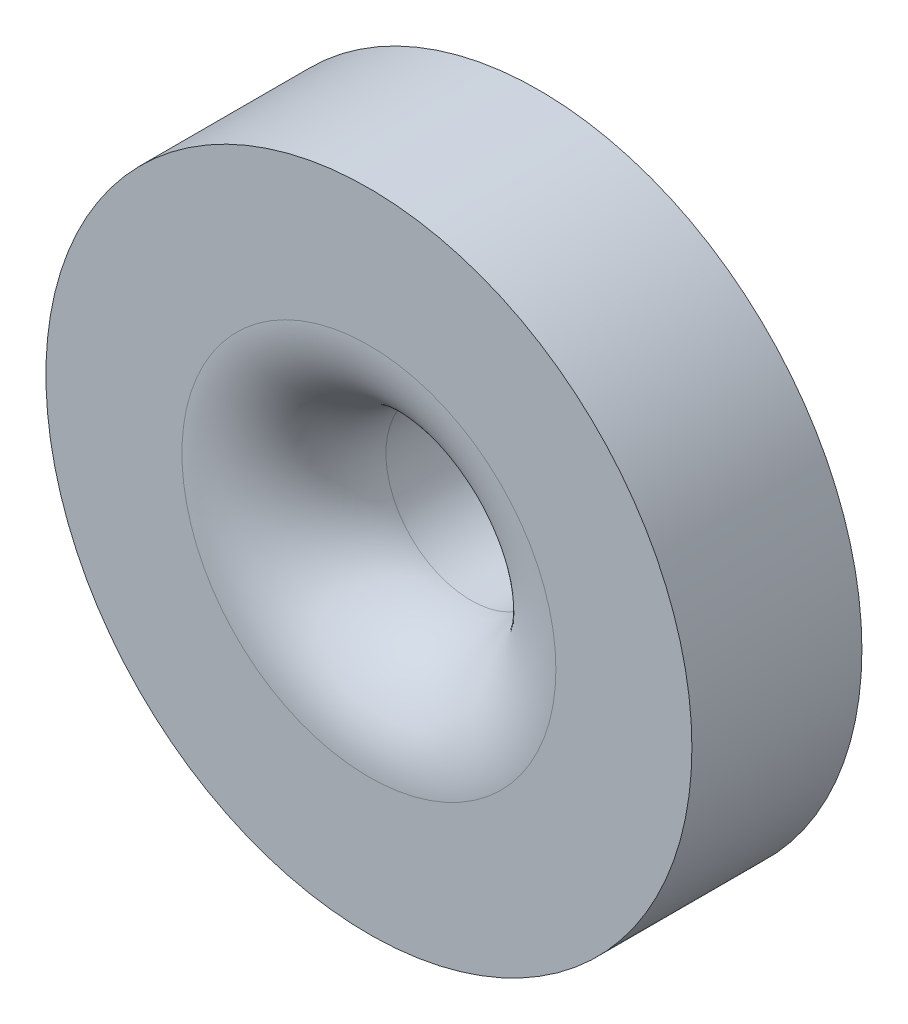
ISO-10303-21;
HEADER;
FILE_DESCRIPTION(('STEP AP214'),'2;1');
FILE_NAME('part.step','',(''),(''),'','','');
FILE_SCHEMA(('AUTOMOTIVE_DESIGN { 1 0 10303 214 1 1 1 1 }'));
ENDSEC;
DATA;
#1=APPLICATION_CONTEXT('core data for automotive mechanical design processes');
#2=APPLICATION_PROTOCOL_DEFINITION('international standard','automotive_design',2000,#1);
#3=PRODUCT_CONTEXT('',#1,'mechanical');
#4=PRODUCT('Part','Part','',(#3));
#5=PRODUCT_RELATED_PRODUCT_CATEGORY('part','',(#4));
#6=PRODUCT_DEFINITION_FORMATION('','',#4);
#7=PRODUCT_DEFINITION_CONTEXT('part definition',#1,'design');
#8=PRODUCT_DEFINITION('design','',#6,#7);
#9=PRODUCT_DEFINITION_SHAPE('','',#8);
#10=(LENGTH_UNIT() NAMED_UNIT(*) SI_UNIT(.MILLI.,.METRE.));
#11=(NAMED_UNIT(*) PLANE_ANGLE_UNIT() SI_UNIT($,.RADIAN.));
#12=(NAMED_UNIT(*) SI_UNIT($,.STERADIAN.) SOLID_ANGLE_UNIT());
#13=UNCERTAINTY_MEASURE_WITH_UNIT(LENGTH_MEASURE(1.E-05),#10,'distance_accuracy_value','');
#14=(GEOMETRIC_REPRESENTATION_CONTEXT(3) GLOBAL_UNCERTAINTY_ASSIGNED_CONTEXT((#13)) GLOBAL_UNIT_ASSIGNED_CONTEXT((#10,
#11,#12)) REPRESENTATION_CONTEXT('',''));
#15=CARTESIAN_POINT('',(0.,0.,0.));
#16=DIRECTION('',(0.,0.,1.));
#17=DIRECTION('',(1.,0.,0.));
#18=AXIS2_PLACEMENT_3D('',#15,#16,#17);
#19=CARTESIAN_POINT('',(0.,0.,5.));
#20=DIRECTION('',(0.,0.,-1.));
#21=DIRECTION('',(-1.,0.,0.));
#22=AXIS2_PLACEMENT_3D('',#19,#20,#21);
#23=CYLINDRICAL_SURFACE('',#22,9.5);
#24=CARTESIAN_POINT('',(0.,0.,5.));
#25=DIRECTION('',(0.,0.,1.));
#26=DIRECTION('',(1.,0.,0.));
#27=AXIS2_PLACEMENT_3D('',#24,#25,#26);
#28=CIRCLE('',#27,9.5);
#29=CARTESIAN_POINT('',(9.5,0.,5.));
#30=VERTEX_POINT('',#29);
#31=EDGE_CURVE('E42',#30,#30,#28,.T.);
#32=ORIENTED_EDGE('',*,*,#31,.F.);
#33=EDGE_LOOP('',(#32));
#34=FACE_BOUND('',#33,.T.);
#35=CARTESIAN_POINT('',(0.,0.,0.));
#36=DIRECTION('',(0.,0.,1.));
#37=DIRECTION('',(1.,0.,0.));
#38=AXIS2_PLACEMENT_3D('',#35,#36,#37);
#39=CIRCLE('',#38,9.5);
#40=CARTESIAN_POINT('',(9.5,0.,0.));
#41=VERTEX_POINT('',#40);
#42=EDGE_CURVE('E46',#41,#41,#39,.T.);
#43=ORIENTED_EDGE('',*,*,#42,.T.);
#44=EDGE_LOOP('',(#43));
#45=FACE_BOUND('',#44,.T.);
#46=ADVANCED_FACE('F31',(#34,#45),#23,.T.);
#47=CARTESIAN_POINT('',(0.,0.,5.));
#48=DIRECTION('',(0.,0.,1.));
#49=DIRECTION('',(1.,0.,0.));
#50=AXIS2_PLACEMENT_3D('',#47,#48,#49);
#51=PLANE('',#50);
#52=CARTESIAN_POINT('',(0.,0.,5.));
#53=DIRECTION('',(0.,0.,1.));
#54=DIRECTION('',(1.,0.,0.));
#55=AXIS2_PLACEMENT_3D('',#52,#53,#54);
#56=CIRCLE('',#55,5.5);
#57=CARTESIAN_POINT('',(5.5,0.,5.));
#58=VERTEX_POINT('',#57);
#59=EDGE_CURVE('E10',#58,#58,#56,.F.);
#60=ORIENTED_EDGE('',*,*,#59,.T.);
#61=EDGE_LOOP('',(#60));
#62=FACE_BOUND('',#61,.T.);
#63=ORIENTED_EDGE('',*,*,#31,.T.);
#64=EDGE_LOOP('',(#63));
#65=FACE_BOUND('',#64,.T.);
#66=ADVANCED_FACE('F60',(#62,#65),#51,.T.);
#67=CARTESIAN_POINT('',(0.,0.,0.));
#68=DIRECTION('',(0.,0.,1.));
#69=DIRECTION('',(1.,0.,0.));
#70=AXIS2_PLACEMENT_3D('',#67,#68,#69);
#71=PLANE('',#70);
#72=CARTESIAN_POINT('',(0.,0.,0.));
#73=DIRECTION('',(0.,0.,1.));
#74=DIRECTION('',(1.,0.,0.));
#75=AXIS2_PLACEMENT_3D('',#72,#73,#74);
#76=CIRCLE('',#75,2.5);
#77=CARTESIAN_POINT('',(2.5,0.,0.));
#78=VERTEX_POINT('',#77);
#79=EDGE_CURVE('E50',#78,#78,#76,.F.);
#80=ORIENTED_EDGE('',*,*,#79,.F.);
#81=EDGE_LOOP('',(#80));
#82=FACE_BOUND('',#81,.T.);
#83=ORIENTED_EDGE('',*,*,#42,.F.);
#84=EDGE_LOOP('',(#83));
#85=FACE_BOUND('',#84,.T.);
#86=ADVANCED_FACE('F57',(#82,#85),#71,.F.);
#87=CARTESIAN_POINT('',(0.,0.,-7.07106781186548));
#88=DIRECTION('',(0.,0.,1.));
#89=DIRECTION('',(1.,0.,0.));
#90=AXIS2_PLACEMENT_3D('',#87,#88,#89);
#91=CYLINDRICAL_SURFACE('',#90,2.5);
#92=CARTESIAN_POINT('',(0.,0.,2.));
#93=DIRECTION('',(0.,0.,1.));
#94=DIRECTION('',(1.,0.,0.));
#95=AXIS2_PLACEMENT_3D('',#92,#93,#94);
#96=CIRCLE('',#95,2.5);
#97=CARTESIAN_POINT('',(2.5,0.,2.));
#98=VERTEX_POINT('',#97);
#99=EDGE_CURVE('E38',#98,#98,#96,.T.);
#100=ORIENTED_EDGE('',*,*,#99,.T.);
#101=EDGE_LOOP('',(#100));
#102=FACE_BOUND('',#101,.T.);
#103=ORIENTED_EDGE('',*,*,#79,.T.);
#104=EDGE_LOOP('',(#103));
#105=FACE_BOUND('',#104,.T.);
#106=ADVANCED_FACE('F55',(#102,#105),#91,.F.);
#107=CARTESIAN_POINT('',(0.,0.,2.));
#108=DIRECTION('',(0.,0.,1.));
#109=DIRECTION('',(1.,0.,0.));
#110=AXIS2_PLACEMENT_3D('',#107,#108,#109);
#111=TOROIDAL_SURFACE('',#110,5.5,3.);
#112=ORIENTED_EDGE('',*,*,#59,.F.);
#113=EDGE_LOOP('',(#112));
#114=FACE_BOUND('',#113,.T.);
#115=ORIENTED_EDGE('',*,*,#99,.F.);
#116=EDGE_LOOP('',(#115));
#117=FACE_BOUND('',#116,.T.);
#118=ADVANCED_FACE('F33',(#114,#117),#111,.T.);
#119=CLOSED_SHELL('',(#46,#66,#86,#106,#118));
#120=MANIFOLD_SOLID_BREP('B2',#119);
#121=ADVANCED_BREP_SHAPE_REPRESENTATION('',(#18,#120),#14);
#122=SHAPE_DEFINITION_REPRESENTATION(#9,#121);
ENDSEC;
END-ISO-10303-21;
